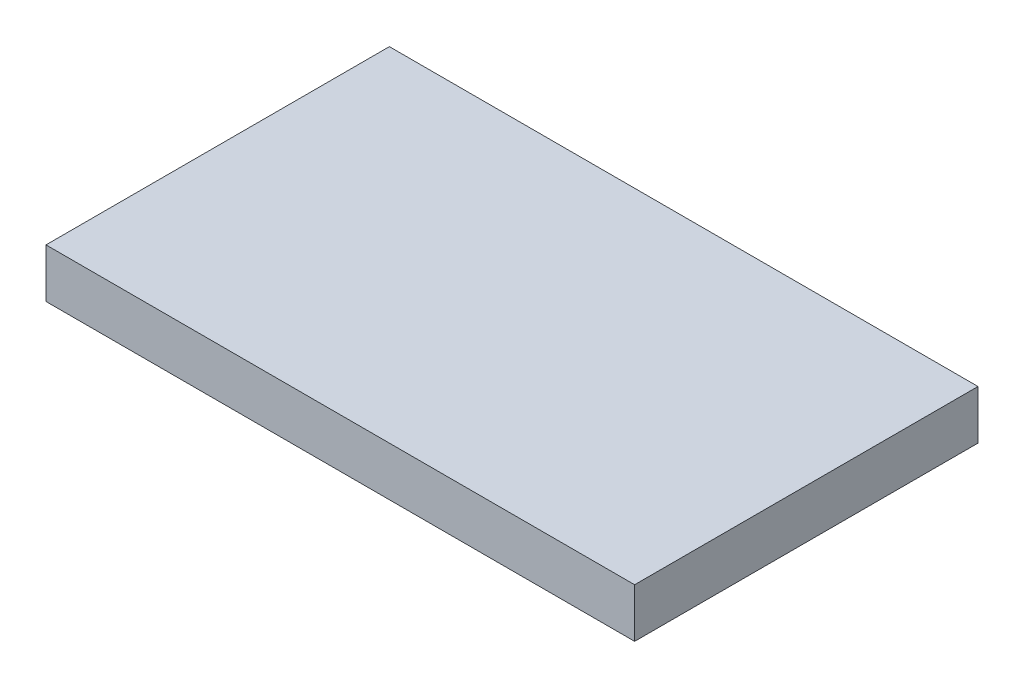
ISO-10303-21;
HEADER;
FILE_DESCRIPTION(('STEP AP214'),'2;1');
FILE_NAME('part.step','',(''),(''),'','','');
FILE_SCHEMA(('AUTOMOTIVE_DESIGN { 1 0 10303 214 1 1 1 1 }'));
ENDSEC;
DATA;
#1=APPLICATION_CONTEXT('core data for automotive mechanical design processes');
#2=APPLICATION_PROTOCOL_DEFINITION('international standard','automotive_design',2000,#1);
#3=PRODUCT_CONTEXT('',#1,'mechanical');
#4=PRODUCT('Part','Part','',(#3));
#5=PRODUCT_RELATED_PRODUCT_CATEGORY('part','',(#4));
#6=PRODUCT_DEFINITION_FORMATION('','',#4);
#7=PRODUCT_DEFINITION_CONTEXT('part definition',#1,'design');
#8=PRODUCT_DEFINITION('design','',#6,#7);
#9=PRODUCT_DEFINITION_SHAPE('','',#8);
#10=(LENGTH_UNIT() NAMED_UNIT(*) SI_UNIT(.MILLI.,.METRE.));
#11=(NAMED_UNIT(*) PLANE_ANGLE_UNIT() SI_UNIT($,.RADIAN.));
#12=(NAMED_UNIT(*) SI_UNIT($,.STERADIAN.) SOLID_ANGLE_UNIT());
#13=UNCERTAINTY_MEASURE_WITH_UNIT(LENGTH_MEASURE(1.E-05),#10,'distance_accuracy_value','');
#14=(GEOMETRIC_REPRESENTATION_CONTEXT(3) GLOBAL_UNCERTAINTY_ASSIGNED_CONTEXT((#13)) GLOBAL_UNIT_ASSIGNED_CONTEXT((#10,
#11,#12)) REPRESENTATION_CONTEXT('',''));
#15=CARTESIAN_POINT('',(0.,0.,0.));
#16=DIRECTION('',(0.,0.,1.));
#17=DIRECTION('',(1.,0.,0.));
#18=AXIS2_PLACEMENT_3D('',#15,#16,#17);
#19=CARTESIAN_POINT('',(0.,5.,0.));
#20=DIRECTION('',(1.,0.,0.));
#21=DIRECTION('',(0.,0.,-1.));
#22=AXIS2_PLACEMENT_3D('',#19,#20,#21);
#23=PLANE('',#22);
#24=DIRECTION('',(0.,0.,1.));
#25=VECTOR('',#24,1.);
#26=CARTESIAN_POINT('',(0.,0.,0.));
#27=LINE('',#26,#25);
#28=CARTESIAN_POINT('',(0.,0.,-35.));
#29=VERTEX_POINT('',#28);
#30=CARTESIAN_POINT('',(0.,0.,0.));
#31=VERTEX_POINT('',#30);
#32=EDGE_CURVE('E99',#29,#31,#27,.T.);
#33=ORIENTED_EDGE('',*,*,#32,.T.);
#34=DIRECTION('',(0.,-1.,0.));
#35=VECTOR('',#34,1.);
#36=CARTESIAN_POINT('',(0.,5.,0.));
#37=LINE('',#36,#35);
#38=CARTESIAN_POINT('',(0.,5.,0.));
#39=VERTEX_POINT('',#38);
#40=EDGE_CURVE('E11',#39,#31,#37,.T.);
#41=ORIENTED_EDGE('',*,*,#40,.F.);
#42=DIRECTION('',(0.,0.,1.));
#43=VECTOR('',#42,1.);
#44=CARTESIAN_POINT('',(0.,5.,0.));
#45=LINE('',#44,#43);
#46=CARTESIAN_POINT('',(0.,5.,-35.));
#47=VERTEX_POINT('',#46);
#48=EDGE_CURVE('E87',#47,#39,#45,.T.);
#49=ORIENTED_EDGE('',*,*,#48,.F.);
#50=DIRECTION('',(0.,-1.,0.));
#51=VECTOR('',#50,1.);
#52=CARTESIAN_POINT('',(0.,5.,-35.));
#53=LINE('',#52,#51);
#54=EDGE_CURVE('E95',#47,#29,#53,.T.);
#55=ORIENTED_EDGE('',*,*,#54,.T.);
#56=EDGE_LOOP('',(#33,#41,#49,#55));
#57=FACE_BOUND('',#56,.T.);
#58=ADVANCED_FACE('F36',(#57),#23,.F.);
#59=CARTESIAN_POINT('',(0.,5.,0.));
#60=DIRECTION('',(0.,0.,-1.));
#61=DIRECTION('',(-1.,0.,0.));
#62=AXIS2_PLACEMENT_3D('',#59,#60,#61);
#63=PLANE('',#62);
#64=DIRECTION('',(1.,0.,0.));
#65=VECTOR('',#64,1.);
#66=CARTESIAN_POINT('',(0.,0.,0.));
#67=LINE('',#66,#65);
#68=CARTESIAN_POINT('',(60.,0.,0.));
#69=VERTEX_POINT('',#68);
#70=EDGE_CURVE('E91',#31,#69,#67,.T.);
#71=ORIENTED_EDGE('',*,*,#70,.T.);
#72=DIRECTION('',(0.,-1.,0.));
#73=VECTOR('',#72,1.);
#74=CARTESIAN_POINT('',(60.,5.,0.));
#75=LINE('',#74,#73);
#76=CARTESIAN_POINT('',(60.,5.,0.));
#77=VERTEX_POINT('',#76);
#78=EDGE_CURVE('E44',#77,#69,#75,.T.);
#79=ORIENTED_EDGE('',*,*,#78,.F.);
#80=DIRECTION('',(1.,0.,0.));
#81=VECTOR('',#80,1.);
#82=CARTESIAN_POINT('',(0.,5.,0.));
#83=LINE('',#82,#81);
#84=EDGE_CURVE('E82',#39,#77,#83,.T.);
#85=ORIENTED_EDGE('',*,*,#84,.F.);
#86=ORIENTED_EDGE('',*,*,#40,.T.);
#87=EDGE_LOOP('',(#71,#79,#85,#86));
#88=FACE_BOUND('',#87,.T.);
#89=ADVANCED_FACE('F90',(#88),#63,.F.);
#90=CARTESIAN_POINT('',(60.,5.,0.));
#91=DIRECTION('',(-1.,0.,0.));
#92=DIRECTION('',(0.,0.,1.));
#93=AXIS2_PLACEMENT_3D('',#90,#91,#92);
#94=PLANE('',#93);
#95=DIRECTION('',(0.,0.,-1.));
#96=VECTOR('',#95,1.);
#97=CARTESIAN_POINT('',(60.,0.,0.));
#98=LINE('',#97,#96);
#99=CARTESIAN_POINT('',(60.,0.,-35.));
#100=VERTEX_POINT('',#99);
#101=EDGE_CURVE('E69',#69,#100,#98,.T.);
#102=ORIENTED_EDGE('',*,*,#101,.T.);
#103=DIRECTION('',(0.,-1.,0.));
#104=VECTOR('',#103,1.);
#105=CARTESIAN_POINT('',(60.,5.,-35.));
#106=LINE('',#105,#104);
#107=CARTESIAN_POINT('',(60.,5.,-35.));
#108=VERTEX_POINT('',#107);
#109=EDGE_CURVE('E92',#108,#100,#106,.T.);
#110=ORIENTED_EDGE('',*,*,#109,.F.);
#111=DIRECTION('',(0.,0.,-1.));
#112=VECTOR('',#111,1.);
#113=CARTESIAN_POINT('',(60.,5.,0.));
#114=LINE('',#113,#112);
#115=EDGE_CURVE('E85',#77,#108,#114,.T.);
#116=ORIENTED_EDGE('',*,*,#115,.F.);
#117=ORIENTED_EDGE('',*,*,#78,.T.);
#118=EDGE_LOOP('',(#102,#110,#116,#117));
#119=FACE_BOUND('',#118,.T.);
#120=ADVANCED_FACE('F93',(#119),#94,.F.);
#121=CARTESIAN_POINT('',(0.,5.,-35.));
#122=DIRECTION('',(0.,0.,1.));
#123=DIRECTION('',(1.,0.,0.));
#124=AXIS2_PLACEMENT_3D('',#121,#122,#123);
#125=PLANE('',#124);
#126=DIRECTION('',(-1.,0.,0.));
#127=VECTOR('',#126,1.);
#128=CARTESIAN_POINT('',(0.,0.,-35.));
#129=LINE('',#128,#127);
#130=EDGE_CURVE('E75',#100,#29,#129,.T.);
#131=ORIENTED_EDGE('',*,*,#130,.T.);
#132=ORIENTED_EDGE('',*,*,#54,.F.);
#133=DIRECTION('',(-1.,0.,0.));
#134=VECTOR('',#133,1.);
#135=CARTESIAN_POINT('',(0.,5.,-35.));
#136=LINE('',#135,#134);
#137=EDGE_CURVE('E52',#108,#47,#136,.T.);
#138=ORIENTED_EDGE('',*,*,#137,.F.);
#139=ORIENTED_EDGE('',*,*,#109,.T.);
#140=EDGE_LOOP('',(#131,#132,#138,#139));
#141=FACE_BOUND('',#140,.T.);
#142=ADVANCED_FACE('F106',(#141),#125,.F.);
#143=CARTESIAN_POINT('',(0.,5.,0.));
#144=DIRECTION('',(0.,-1.,0.));
#145=DIRECTION('',(0.,0.,-1.));
#146=AXIS2_PLACEMENT_3D('',#143,#144,#145);
#147=PLANE('',#146);
#148=ORIENTED_EDGE('',*,*,#48,.T.);
#149=ORIENTED_EDGE('',*,*,#84,.T.);
#150=ORIENTED_EDGE('',*,*,#115,.T.);
#151=ORIENTED_EDGE('',*,*,#137,.T.);
#152=EDGE_LOOP('',(#148,#149,#150,#151));
#153=FACE_BOUND('',#152,.T.);
#154=ADVANCED_FACE('F83',(#153),#147,.F.);
#155=CARTESIAN_POINT('',(0.,0.,0.));
#156=DIRECTION('',(0.,-1.,0.));
#157=DIRECTION('',(0.,0.,-1.));
#158=AXIS2_PLACEMENT_3D('',#155,#156,#157);
#159=PLANE('',#158);
#160=ORIENTED_EDGE('',*,*,#32,.F.);
#161=ORIENTED_EDGE('',*,*,#130,.F.);
#162=ORIENTED_EDGE('',*,*,#101,.F.);
#163=ORIENTED_EDGE('',*,*,#70,.F.);
#164=EDGE_LOOP('',(#160,#161,#162,#163));
#165=FACE_BOUND('',#164,.T.);
#166=ADVANCED_FACE('F109',(#165),#159,.T.);
#167=CLOSED_SHELL('',(#58,#89,#120,#142,#154,#166));
#168=MANIFOLD_SOLID_BREP('B2',#167);
#169=ADVANCED_BREP_SHAPE_REPRESENTATION('',(#18,#168),#14);
#170=SHAPE_DEFINITION_REPRESENTATION(#9,#169);
ENDSEC;
END-ISO-10303-21;
